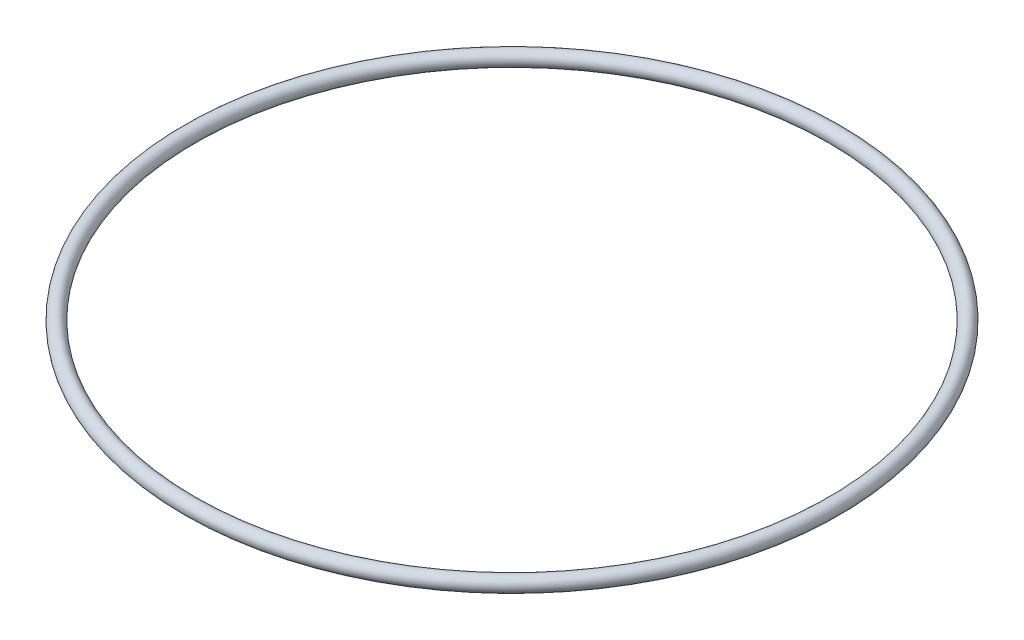
ISO-10303-21;
HEADER;
FILE_DESCRIPTION(('STEP AP214'),'2;1');
FILE_NAME('part.step','',(''),(''),'','','');
FILE_SCHEMA(('AUTOMOTIVE_DESIGN { 1 0 10303 214 1 1 1 1 }'));
ENDSEC;
DATA;
#1=APPLICATION_CONTEXT('core data for automotive mechanical design processes');
#2=APPLICATION_PROTOCOL_DEFINITION('international standard','automotive_design',2000,#1);
#3=PRODUCT_CONTEXT('',#1,'mechanical');
#4=PRODUCT('Part','Part','',(#3));
#5=PRODUCT_RELATED_PRODUCT_CATEGORY('part','',(#4));
#6=PRODUCT_DEFINITION_FORMATION('','',#4);
#7=PRODUCT_DEFINITION_CONTEXT('part definition',#1,'design');
#8=PRODUCT_DEFINITION('design','',#6,#7);
#9=PRODUCT_DEFINITION_SHAPE('','',#8);
#10=(LENGTH_UNIT() NAMED_UNIT(*) SI_UNIT(.MILLI.,.METRE.));
#11=(NAMED_UNIT(*) PLANE_ANGLE_UNIT() SI_UNIT($,.RADIAN.));
#12=(NAMED_UNIT(*) SI_UNIT($,.STERADIAN.) SOLID_ANGLE_UNIT());
#13=UNCERTAINTY_MEASURE_WITH_UNIT(LENGTH_MEASURE(1.E-05),#10,'distance_accuracy_value','');
#14=(GEOMETRIC_REPRESENTATION_CONTEXT(3) GLOBAL_UNCERTAINTY_ASSIGNED_CONTEXT((#13)) GLOBAL_UNIT_ASSIGNED_CONTEXT((#10,
#11,#12)) REPRESENTATION_CONTEXT('',''));
#15=CARTESIAN_POINT('',(0.,0.,0.));
#16=DIRECTION('',(0.,0.,1.));
#17=DIRECTION('',(1.,0.,0.));
#18=AXIS2_PLACEMENT_3D('',#15,#16,#17);
#19=CARTESIAN_POINT('',(0.,0.,0.));
#20=DIRECTION('',(0.,1.,0.));
#21=DIRECTION('',(0.,0.,1.));
#22=AXIS2_PLACEMENT_3D('',#19,#20,#21);
#23=TOROIDAL_SURFACE('',#22,65.5,1.5);
#24=CARTESIAN_POINT('',(0.,0.,67.));
#25=VERTEX_POINT('',#24);
#26=VERTEX_LOOP('',#25);
#27=FACE_BOUND('',#26,.T.);
#28=ADVANCED_FACE('F32',(#27),#23,.T.);
#29=CLOSED_SHELL('',(#28));
#30=MANIFOLD_SOLID_BREP('B2',#29);
#31=ADVANCED_BREP_SHAPE_REPRESENTATION('',(#18,#30),#14);
#32=SHAPE_DEFINITION_REPRESENTATION(#9,#31);
ENDSEC;
END-ISO-10303-21;
